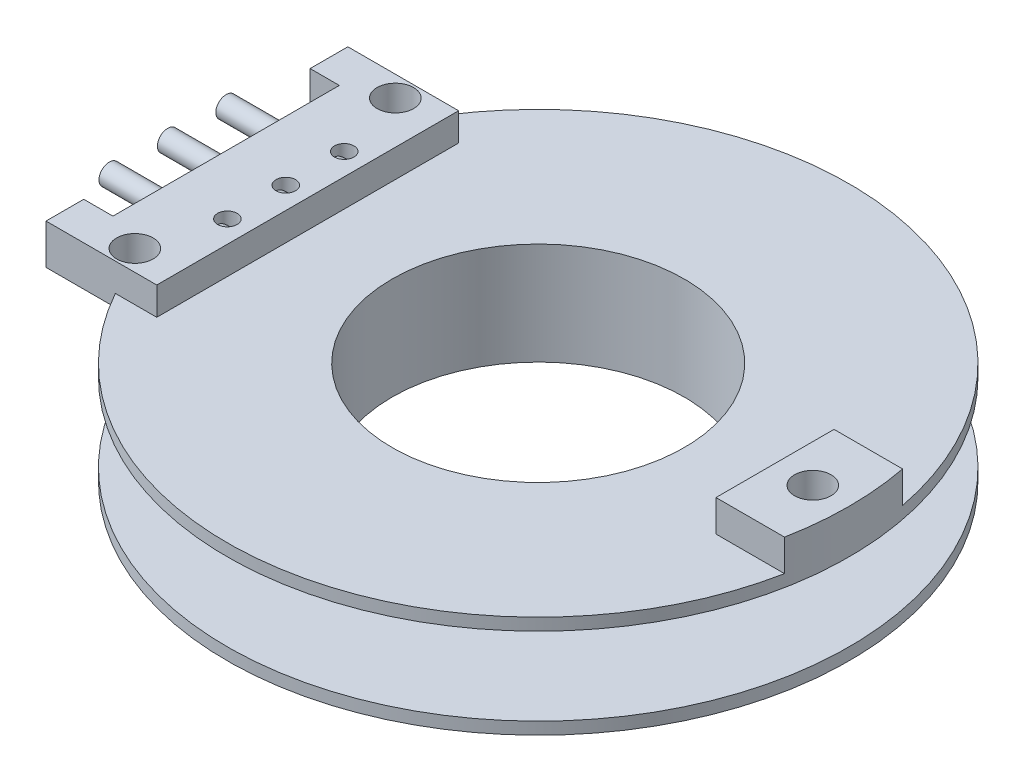
ISO-10303-21;
HEADER;
FILE_DESCRIPTION(('STEP AP214'),'2;1');
FILE_NAME('part.step','',(''),(''),'','','');
FILE_SCHEMA(('AUTOMOTIVE_DESIGN { 1 0 10303 214 1 1 1 1 }'));
ENDSEC;
DATA;
#1=APPLICATION_CONTEXT('core data for automotive mechanical design processes');
#2=APPLICATION_PROTOCOL_DEFINITION('international standard','automotive_design',2000,#1);
#3=PRODUCT_CONTEXT('',#1,'mechanical');
#4=PRODUCT('Part','Part','',(#3));
#5=PRODUCT_RELATED_PRODUCT_CATEGORY('part','',(#4));
#6=PRODUCT_DEFINITION_FORMATION('','',#4);
#7=PRODUCT_DEFINITION_CONTEXT('part definition',#1,'design');
#8=PRODUCT_DEFINITION('design','',#6,#7);
#9=PRODUCT_DEFINITION_SHAPE('','',#8);
#10=(LENGTH_UNIT() NAMED_UNIT(*) SI_UNIT(.MILLI.,.METRE.));
#11=(NAMED_UNIT(*) PLANE_ANGLE_UNIT() SI_UNIT($,.RADIAN.));
#12=(NAMED_UNIT(*) SI_UNIT($,.STERADIAN.) SOLID_ANGLE_UNIT());
#13=UNCERTAINTY_MEASURE_WITH_UNIT(LENGTH_MEASURE(1.E-05),#10,'distance_accuracy_value','');
#14=(GEOMETRIC_REPRESENTATION_CONTEXT(3) GLOBAL_UNCERTAINTY_ASSIGNED_CONTEXT((#13)) GLOBAL_UNIT_ASSIGNED_CONTEXT((#10,
#11,#12)) REPRESENTATION_CONTEXT('',''));
#15=CARTESIAN_POINT('',(0.,0.,0.));
#16=DIRECTION('',(0.,0.,1.));
#17=DIRECTION('',(1.,0.,0.));
#18=AXIS2_PLACEMENT_3D('',#15,#16,#17);
#19=CARTESIAN_POINT('',(-9.82,2.425,-2.4));
#20=DIRECTION('',(-1.,0.,0.));
#21=DIRECTION('',(0.,-1.,0.));
#22=AXIS2_PLACEMENT_3D('',#19,#20,#21);
#23=CYLINDRICAL_SURFACE('',#22,0.425);
#24=CARTESIAN_POINT('',(-9.82,2.425,-2.4));
#25=DIRECTION('',(-1.,0.,0.));
#26=DIRECTION('',(0.,-1.,0.));
#27=AXIS2_PLACEMENT_3D('',#24,#25,#26);
#28=CIRCLE('',#27,0.425);
#29=CARTESIAN_POINT('',(-9.82,2.,-2.4));
#30=VERTEX_POINT('',#29);
#31=EDGE_CURVE('E11',#30,#30,#28,.T.);
#32=ORIENTED_EDGE('',*,*,#31,.T.);
#33=EDGE_LOOP('',(#32));
#34=FACE_BOUND('',#33,.T.);
#35=CARTESIAN_POINT('',(-15.22,2.425,-2.4));
#36=DIRECTION('',(-1.,0.,0.));
#37=DIRECTION('',(0.,-1.,0.));
#38=AXIS2_PLACEMENT_3D('',#35,#36,#37);
#39=CIRCLE('',#38,0.425);
#40=CARTESIAN_POINT('',(-15.22,2.,-2.4));
#41=VERTEX_POINT('',#40);
#42=EDGE_CURVE('E58',#41,#41,#39,.T.);
#43=ORIENTED_EDGE('',*,*,#42,.F.);
#44=EDGE_LOOP('',(#43));
#45=FACE_BOUND('',#44,.T.);
#46=ADVANCED_FACE('F51',(#34,#45),#23,.T.);
#47=CARTESIAN_POINT('',(-9.82,2.425,-2.4));
#48=DIRECTION('',(-1.,0.,0.));
#49=DIRECTION('',(0.,-1.,0.));
#50=AXIS2_PLACEMENT_3D('',#47,#48,#49);
#51=PLANE('',#50);
#52=ORIENTED_EDGE('',*,*,#31,.F.);
#53=EDGE_LOOP('',(#52));
#54=FACE_BOUND('',#53,.T.);
#55=ADVANCED_FACE('F67',(#54),#51,.F.);
#56=CARTESIAN_POINT('',(-15.22,2.425,-2.4));
#57=DIRECTION('',(-1.,0.,0.));
#58=DIRECTION('',(0.,-1.,0.));
#59=AXIS2_PLACEMENT_3D('',#56,#57,#58);
#60=PLANE('',#59);
#61=ORIENTED_EDGE('',*,*,#42,.T.);
#62=EDGE_LOOP('',(#61));
#63=FACE_BOUND('',#62,.T.);
#64=ADVANCED_FACE('F64',(#63),#60,.T.);
#65=CLOSED_SHELL('',(#46,#55,#64));
#66=MANIFOLD_SOLID_BREP('B2',#65);
#67=CARTESIAN_POINT('',(-9.82,2.425,2.4));
#68=DIRECTION('',(-1.,0.,0.));
#69=DIRECTION('',(0.,-1.,0.));
#70=AXIS2_PLACEMENT_3D('',#67,#68,#69);
#71=CYLINDRICAL_SURFACE('',#70,0.425);
#72=CARTESIAN_POINT('',(-9.82,2.425,2.4));
#73=DIRECTION('',(-1.,0.,0.));
#74=DIRECTION('',(0.,-1.,0.));
#75=AXIS2_PLACEMENT_3D('',#72,#73,#74);
#76=CIRCLE('',#75,0.425);
#77=CARTESIAN_POINT('',(-9.82,2.,2.4));
#78=VERTEX_POINT('',#77);
#79=EDGE_CURVE('E50',#78,#78,#76,.T.);
#80=ORIENTED_EDGE('',*,*,#79,.T.);
#81=EDGE_LOOP('',(#80));
#82=FACE_BOUND('',#81,.T.);
#83=CARTESIAN_POINT('',(-15.22,2.425,2.4));
#84=DIRECTION('',(-1.,0.,0.));
#85=DIRECTION('',(0.,-1.,0.));
#86=AXIS2_PLACEMENT_3D('',#83,#84,#85);
#87=CIRCLE('',#86,0.425);
#88=CARTESIAN_POINT('',(-15.22,2.,2.4));
#89=VERTEX_POINT('',#88);
#90=EDGE_CURVE('E107',#89,#89,#87,.T.);
#91=ORIENTED_EDGE('',*,*,#90,.F.);
#92=EDGE_LOOP('',(#91));
#93=FACE_BOUND('',#92,.T.);
#94=ADVANCED_FACE('F100',(#82,#93),#71,.T.);
#95=CARTESIAN_POINT('',(-9.82,2.425,2.4));
#96=DIRECTION('',(-1.,0.,0.));
#97=DIRECTION('',(0.,-1.,0.));
#98=AXIS2_PLACEMENT_3D('',#95,#96,#97);
#99=PLANE('',#98);
#100=ORIENTED_EDGE('',*,*,#79,.F.);
#101=EDGE_LOOP('',(#100));
#102=FACE_BOUND('',#101,.T.);
#103=ADVANCED_FACE('F116',(#102),#99,.F.);
#104=CARTESIAN_POINT('',(-15.22,2.425,2.4));
#105=DIRECTION('',(-1.,0.,0.));
#106=DIRECTION('',(0.,-1.,0.));
#107=AXIS2_PLACEMENT_3D('',#104,#105,#106);
#108=PLANE('',#107);
#109=ORIENTED_EDGE('',*,*,#90,.T.);
#110=EDGE_LOOP('',(#109));
#111=FACE_BOUND('',#110,.T.);
#112=ADVANCED_FACE('F113',(#111),#108,.T.);
#113=CLOSED_SHELL('',(#94,#103,#112));
#114=MANIFOLD_SOLID_BREP('B6',#113);
#115=CARTESIAN_POINT('',(-9.82,2.425,0.));
#116=DIRECTION('',(-1.,0.,0.));
#117=DIRECTION('',(0.,-1.,0.));
#118=AXIS2_PLACEMENT_3D('',#115,#116,#117);
#119=CYLINDRICAL_SURFACE('',#118,0.425);
#120=CARTESIAN_POINT('',(-9.82,2.425,0.));
#121=DIRECTION('',(-1.,0.,0.));
#122=DIRECTION('',(0.,-1.,0.));
#123=AXIS2_PLACEMENT_3D('',#120,#121,#122);
#124=CIRCLE('',#123,0.425);
#125=CARTESIAN_POINT('',(-9.82,2.,0.));
#126=VERTEX_POINT('',#125);
#127=EDGE_CURVE('E99',#126,#126,#124,.T.);
#128=ORIENTED_EDGE('',*,*,#127,.T.);
#129=EDGE_LOOP('',(#128));
#130=FACE_BOUND('',#129,.T.);
#131=CARTESIAN_POINT('',(-15.22,2.425,0.));
#132=DIRECTION('',(-1.,0.,0.));
#133=DIRECTION('',(0.,-1.,0.));
#134=AXIS2_PLACEMENT_3D('',#131,#132,#133);
#135=CIRCLE('',#134,0.425);
#136=CARTESIAN_POINT('',(-15.22,2.,0.));
#137=VERTEX_POINT('',#136);
#138=EDGE_CURVE('E157',#137,#137,#135,.T.);
#139=ORIENTED_EDGE('',*,*,#138,.F.);
#140=EDGE_LOOP('',(#139));
#141=FACE_BOUND('',#140,.T.);
#142=ADVANCED_FACE('F150',(#130,#141),#119,.T.);
#143=CARTESIAN_POINT('',(-9.82,2.425,0.));
#144=DIRECTION('',(-1.,0.,0.));
#145=DIRECTION('',(0.,-1.,0.));
#146=AXIS2_PLACEMENT_3D('',#143,#144,#145);
#147=PLANE('',#146);
#148=ORIENTED_EDGE('',*,*,#127,.F.);
#149=EDGE_LOOP('',(#148));
#150=FACE_BOUND('',#149,.T.);
#151=ADVANCED_FACE('F166',(#150),#147,.F.);
#152=CARTESIAN_POINT('',(-15.22,2.425,0.));
#153=DIRECTION('',(-1.,0.,0.));
#154=DIRECTION('',(0.,-1.,0.));
#155=AXIS2_PLACEMENT_3D('',#152,#153,#154);
#156=PLANE('',#155);
#157=ORIENTED_EDGE('',*,*,#138,.T.);
#158=EDGE_LOOP('',(#157));
#159=FACE_BOUND('',#158,.T.);
#160=ADVANCED_FACE('F163',(#159),#156,.T.);
#161=CLOSED_SHELL('',(#142,#151,#160));
#162=MANIFOLD_SOLID_BREP('B45',#161);
#163=CARTESIAN_POINT('',(6.,2.1,0.));
#164=DIRECTION('',(0.,-1.,0.));
#165=DIRECTION('',(1.,0.,0.));
#166=AXIS2_PLACEMENT_3D('',#163,#164,#165);
#167=PLANE('',#166);
#168=CARTESIAN_POINT('',(0.,2.1,0.));
#169=DIRECTION('',(0.,1.,0.));
#170=DIRECTION('',(-1.,0.,0.));
#171=AXIS2_PLACEMENT_3D('',#168,#169,#170);
#172=CIRCLE('',#171,6.);
#173=CARTESIAN_POINT('',(-6.,2.1,0.));
#174=VERTEX_POINT('',#173);
#175=EDGE_CURVE('E446',#174,#174,#172,.T.);
#176=ORIENTED_EDGE('',*,*,#175,.F.);
#177=EDGE_LOOP('',(#176));
#178=FACE_BOUND('',#177,.T.);
#179=CARTESIAN_POINT('',(0.,2.1,0.));
#180=DIRECTION('',(0.,1.,0.));
#181=DIRECTION('',(-1.,0.,0.));
#182=AXIS2_PLACEMENT_3D('',#179,#180,#181);
#183=CIRCLE('',#182,12.775);
#184=CARTESIAN_POINT('',(12.5427269762201,2.1,-2.425));
#185=VERTEX_POINT('',#184);
#186=CARTESIAN_POINT('',(-11.1696295820408,2.1,-6.2));
#187=VERTEX_POINT('',#186);
#188=EDGE_CURVE('E451',#185,#187,#183,.T.);
#189=ORIENTED_EDGE('',*,*,#188,.T.);
#190=DIRECTION('',(1.,0.,0.));
#191=VECTOR('',#190,1.);
#192=CARTESIAN_POINT('',(6.,2.1,-6.2));
#193=LINE('',#192,#191);
#194=CARTESIAN_POINT('',(-9.47,2.1,-6.2));
#195=VERTEX_POINT('',#194);
#196=EDGE_CURVE('E206',#187,#195,#193,.T.);
#197=ORIENTED_EDGE('',*,*,#196,.T.);
#198=DIRECTION('',(0.,0.,1.));
#199=VECTOR('',#198,1.);
#200=CARTESIAN_POINT('',(-9.47,2.1,0.));
#201=LINE('',#200,#199);
#202=CARTESIAN_POINT('',(-9.47,2.1,6.2));
#203=VERTEX_POINT('',#202);
#204=EDGE_CURVE('E213',#195,#203,#201,.T.);
#205=ORIENTED_EDGE('',*,*,#204,.T.);
#206=DIRECTION('',(-1.,0.,0.));
#207=VECTOR('',#206,1.);
#208=CARTESIAN_POINT('',(6.,2.1,6.2));
#209=LINE('',#208,#207);
#210=CARTESIAN_POINT('',(-11.1696295820408,2.1,6.2));
#211=VERTEX_POINT('',#210);
#212=EDGE_CURVE('E379',#203,#211,#209,.T.);
#213=ORIENTED_EDGE('',*,*,#212,.T.);
#214=CARTESIAN_POINT('',(12.5427269762201,2.1,2.425));
#215=VERTEX_POINT('',#214);
#216=EDGE_CURVE('E450',#211,#215,#183,.T.);
#217=ORIENTED_EDGE('',*,*,#216,.T.);
#218=DIRECTION('',(1.,0.,0.));
#219=VECTOR('',#218,1.);
#220=CARTESIAN_POINT('',(9.72728122344574,2.1,2.425));
#221=LINE('',#220,#219);
#222=CARTESIAN_POINT('',(9.72728122344574,2.1,2.425));
#223=VERTEX_POINT('',#222);
#224=EDGE_CURVE('E405',#223,#215,#221,.T.);
#225=ORIENTED_EDGE('',*,*,#224,.F.);
#226=DIRECTION('',(0.,0.,1.));
#227=VECTOR('',#226,1.);
#228=CARTESIAN_POINT('',(9.72728122344574,2.1,-2.425));
#229=LINE('',#228,#227);
#230=CARTESIAN_POINT('',(9.72728122344574,2.1,-2.425));
#231=VERTEX_POINT('',#230);
#232=EDGE_CURVE('E414',#231,#223,#229,.T.);
#233=ORIENTED_EDGE('',*,*,#232,.F.);
#234=DIRECTION('',(-1.,0.,0.));
#235=VECTOR('',#234,1.);
#236=CARTESIAN_POINT('',(9.72728122344574,2.1,-2.425));
#237=LINE('',#236,#235);
#238=EDGE_CURVE('E400',#185,#231,#237,.T.);
#239=ORIENTED_EDGE('',*,*,#238,.F.);
#240=EDGE_LOOP('',(#189,#197,#205,#213,#217,#225,#233,#239));
#241=FACE_BOUND('',#240,.T.);
#242=ADVANCED_FACE('F191',(#178,#241),#167,.F.);
#243=CARTESIAN_POINT('',(12.775,1.6,0.));
#244=DIRECTION('',(0.,1.,0.));
#245=DIRECTION('',(-1.,0.,0.));
#246=AXIS2_PLACEMENT_3D('',#243,#244,#245);
#247=PLANE('',#246);
#248=CARTESIAN_POINT('',(11.28,1.6,0.));
#249=DIRECTION('',(0.,1.,0.));
#250=DIRECTION('',(-1.,0.,0.));
#251=AXIS2_PLACEMENT_3D('',#248,#249,#250);
#252=CIRCLE('',#251,0.75);
#253=CARTESIAN_POINT('',(10.53,1.6,0.));
#254=VERTEX_POINT('',#253);
#255=EDGE_CURVE('E518',#254,#254,#252,.F.);
#256=ORIENTED_EDGE('',*,*,#255,.F.);
#257=EDGE_LOOP('',(#256));
#258=FACE_BOUND('',#257,.T.);
#259=CARTESIAN_POINT('',(-11.22,1.59999999999999,5.35));
#260=DIRECTION('',(0.,1.,0.));
#261=DIRECTION('',(-1.,0.,0.));
#262=AXIS2_PLACEMENT_3D('',#259,#260,#261);
#263=CIRCLE('',#262,0.75);
#264=CARTESIAN_POINT('',(-11.97,1.59999999999999,5.35));
#265=VERTEX_POINT('',#264);
#266=EDGE_CURVE('E502',#265,#265,#263,.F.);
#267=ORIENTED_EDGE('',*,*,#266,.F.);
#268=EDGE_LOOP('',(#267));
#269=FACE_BOUND('',#268,.T.);
#270=CARTESIAN_POINT('',(-11.22,1.59999999999999,-5.35));
#271=DIRECTION('',(0.,1.,0.));
#272=DIRECTION('',(-1.,0.,0.));
#273=AXIS2_PLACEMENT_3D('',#270,#271,#272);
#274=CIRCLE('',#273,0.75);
#275=CARTESIAN_POINT('',(-11.97,1.59999999999999,-5.35));
#276=VERTEX_POINT('',#275);
#277=EDGE_CURVE('E331',#276,#276,#274,.F.);
#278=ORIENTED_EDGE('',*,*,#277,.F.);
#279=EDGE_LOOP('',(#278));
#280=FACE_BOUND('',#279,.T.);
#281=DIRECTION('',(-1.,0.,0.));
#282=VECTOR('',#281,1.);
#283=CARTESIAN_POINT('',(-14.02,1.6,-6.2));
#284=LINE('',#283,#282);
#285=CARTESIAN_POINT('',(-11.1696295820408,1.6,-6.2));
#286=VERTEX_POINT('',#285);
#287=CARTESIAN_POINT('',(-14.02,1.6,-6.2));
#288=VERTEX_POINT('',#287);
#289=EDGE_CURVE('E314',#286,#288,#284,.T.);
#290=ORIENTED_EDGE('',*,*,#289,.F.);
#291=CARTESIAN_POINT('',(0.,1.6,0.));
#292=DIRECTION('',(0.,1.,0.));
#293=DIRECTION('',(-1.,0.,0.));
#294=AXIS2_PLACEMENT_3D('',#291,#292,#293);
#295=CIRCLE('',#294,12.775);
#296=CARTESIAN_POINT('',(-11.1696295820408,1.6,6.2));
#297=VERTEX_POINT('',#296);
#298=EDGE_CURVE('E454',#297,#286,#295,.T.);
#299=ORIENTED_EDGE('',*,*,#298,.F.);
#300=DIRECTION('',(1.,0.,0.));
#301=VECTOR('',#300,1.);
#302=CARTESIAN_POINT('',(-9.47,1.6,6.2));
#303=LINE('',#302,#301);
#304=CARTESIAN_POINT('',(-14.02,1.6,6.2));
#305=VERTEX_POINT('',#304);
#306=EDGE_CURVE('E372',#305,#297,#303,.T.);
#307=ORIENTED_EDGE('',*,*,#306,.F.);
#308=DIRECTION('',(0.,0.,1.));
#309=VECTOR('',#308,1.);
#310=CARTESIAN_POINT('',(-14.02,1.6,6.2));
#311=LINE('',#310,#309);
#312=CARTESIAN_POINT('',(-14.02,1.6,4.65));
#313=VERTEX_POINT('',#312);
#314=EDGE_CURVE('E368',#313,#305,#311,.T.);
#315=ORIENTED_EDGE('',*,*,#314,.F.);
#316=DIRECTION('',(-1.,0.,0.));
#317=VECTOR('',#316,1.);
#318=CARTESIAN_POINT('',(-14.02,1.6,4.65));
#319=LINE('',#318,#317);
#320=CARTESIAN_POINT('',(-12.82,1.6,4.65));
#321=VERTEX_POINT('',#320);
#322=EDGE_CURVE('E364',#321,#313,#319,.T.);
#323=ORIENTED_EDGE('',*,*,#322,.F.);
#324=DIRECTION('',(0.,0.,1.));
#325=VECTOR('',#324,1.);
#326=CARTESIAN_POINT('',(-12.82,1.6,4.65));
#327=LINE('',#326,#325);
#328=CARTESIAN_POINT('',(-12.82,1.6,-4.65));
#329=VERTEX_POINT('',#328);
#330=EDGE_CURVE('E360',#329,#321,#327,.T.);
#331=ORIENTED_EDGE('',*,*,#330,.F.);
#332=DIRECTION('',(1.,0.,0.));
#333=VECTOR('',#332,1.);
#334=CARTESIAN_POINT('',(-12.82,1.6,-4.65));
#335=LINE('',#334,#333);
#336=CARTESIAN_POINT('',(-14.02,1.6,-4.65));
#337=VERTEX_POINT('',#336);
#338=EDGE_CURVE('E358',#337,#329,#335,.T.);
#339=ORIENTED_EDGE('',*,*,#338,.F.);
#340=DIRECTION('',(0.,0.,1.));
#341=VECTOR('',#340,1.);
#342=CARTESIAN_POINT('',(-14.02,1.6,-4.65));
#343=LINE('',#342,#341);
#344=EDGE_CURVE('E308',#288,#337,#343,.T.);
#345=ORIENTED_EDGE('',*,*,#344,.F.);
#346=EDGE_LOOP('',(#290,#299,#307,#315,#323,#331,#339,#345));
#347=FACE_BOUND('',#346,.T.);
#348=CARTESIAN_POINT('',(0.,1.6,0.));
#349=DIRECTION('',(0.,1.,0.));
#350=DIRECTION('',(-1.,0.,0.));
#351=AXIS2_PLACEMENT_3D('',#348,#349,#350);
#352=CIRCLE('',#351,7.);
#353=CARTESIAN_POINT('',(-7.,1.59999999999999,0.));
#354=VERTEX_POINT('',#353);
#355=EDGE_CURVE('E430',#354,#354,#352,.T.);
#356=ORIENTED_EDGE('',*,*,#355,.T.);
#357=EDGE_LOOP('',(#356));
#358=FACE_BOUND('',#357,.T.);
#359=ADVANCED_FACE('F193',(#258,#269,#280,#347,#358),#247,.F.);
#360=CARTESIAN_POINT('',(0.,2.1,0.));
#361=DIRECTION('',(0.,1.,0.));
#362=DIRECTION('',(-1.,0.,0.));
#363=AXIS2_PLACEMENT_3D('',#360,#361,#362);
#364=CYLINDRICAL_SURFACE('',#363,12.775);
#365=ORIENTED_EDGE('',*,*,#298,.T.);
#366=DIRECTION('',(0.,1.,0.));
#367=VECTOR('',#366,1.);
#368=CARTESIAN_POINT('',(-11.1696295820408,2.1,-6.2));
#369=LINE('',#368,#367);
#370=EDGE_CURVE('E148',#286,#187,#369,.T.);
#371=ORIENTED_EDGE('',*,*,#370,.T.);
#372=ORIENTED_EDGE('',*,*,#188,.F.);
#373=DIRECTION('',(0.,-1.,0.));
#374=VECTOR('',#373,1.);
#375=CARTESIAN_POINT('',(12.5427269762201,3.4,-2.425));
#376=LINE('',#375,#374);
#377=CARTESIAN_POINT('',(12.5427269762201,3.4,-2.425));
#378=VERTEX_POINT('',#377);
#379=EDGE_CURVE('E427',#378,#185,#376,.T.);
#380=ORIENTED_EDGE('',*,*,#379,.F.);
#381=CARTESIAN_POINT('',(0.,3.4,0.));
#382=DIRECTION('',(0.,1.,0.));
#383=DIRECTION('',(-1.,0.,0.));
#384=AXIS2_PLACEMENT_3D('',#381,#382,#383);
#385=CIRCLE('',#384,12.775);
#386=CARTESIAN_POINT('',(12.5427269762201,3.4,2.425));
#387=VERTEX_POINT('',#386);
#388=EDGE_CURVE('E401',#387,#378,#385,.T.);
#389=ORIENTED_EDGE('',*,*,#388,.F.);
#390=DIRECTION('',(0.,-1.,0.));
#391=VECTOR('',#390,1.);
#392=CARTESIAN_POINT('',(12.5427269762201,3.4,2.425));
#393=LINE('',#392,#391);
#394=EDGE_CURVE('E411',#387,#215,#393,.T.);
#395=ORIENTED_EDGE('',*,*,#394,.T.);
#396=ORIENTED_EDGE('',*,*,#216,.F.);
#397=DIRECTION('',(0.,1.,0.));
#398=VECTOR('',#397,1.);
#399=CARTESIAN_POINT('',(-11.1696295820408,2.1,6.2));
#400=LINE('',#399,#398);
#401=EDGE_CURVE('E199',#211,#297,#400,.F.);
#402=ORIENTED_EDGE('',*,*,#401,.T.);
#403=EDGE_LOOP('',(#365,#371,#372,#380,#389,#395,#396,#402));
#404=FACE_BOUND('',#403,.T.);
#405=ADVANCED_FACE('F461',(#404),#364,.T.);
#406=CARTESIAN_POINT('',(0.,2.1,0.));
#407=DIRECTION('',(0.,1.,0.));
#408=DIRECTION('',(-1.,0.,0.));
#409=AXIS2_PLACEMENT_3D('',#406,#407,#408);
#410=CYLINDRICAL_SURFACE('',#409,6.);
#411=CARTESIAN_POINT('',(0.,-2.1,0.));
#412=DIRECTION('',(0.,1.,0.));
#413=DIRECTION('',(-1.,0.,0.));
#414=AXIS2_PLACEMENT_3D('',#411,#412,#413);
#415=CIRCLE('',#414,6.);
#416=CARTESIAN_POINT('',(-6.,-2.1,0.));
#417=VERTEX_POINT('',#416);
#418=EDGE_CURVE('E443',#417,#417,#415,.T.);
#419=ORIENTED_EDGE('',*,*,#418,.F.);
#420=EDGE_LOOP('',(#419));
#421=FACE_BOUND('',#420,.T.);
#422=ORIENTED_EDGE('',*,*,#175,.T.);
#423=EDGE_LOOP('',(#422));
#424=FACE_BOUND('',#423,.T.);
#425=ADVANCED_FACE('F562',(#421,#424),#410,.F.);
#426=CARTESIAN_POINT('',(12.775,-2.1,0.));
#427=DIRECTION('',(0.,1.,0.));
#428=DIRECTION('',(-1.,0.,0.));
#429=AXIS2_PLACEMENT_3D('',#426,#427,#428);
#430=PLANE('',#429);
#431=CARTESIAN_POINT('',(0.,-2.1,0.));
#432=DIRECTION('',(0.,1.,0.));
#433=DIRECTION('',(-1.,0.,0.));
#434=AXIS2_PLACEMENT_3D('',#431,#432,#433);
#435=CIRCLE('',#434,12.775);
#436=CARTESIAN_POINT('',(-12.775,-2.1,0.));
#437=VERTEX_POINT('',#436);
#438=EDGE_CURVE('E440',#437,#437,#435,.T.);
#439=ORIENTED_EDGE('',*,*,#438,.F.);
#440=EDGE_LOOP('',(#439));
#441=FACE_BOUND('',#440,.T.);
#442=ORIENTED_EDGE('',*,*,#418,.T.);
#443=EDGE_LOOP('',(#442));
#444=FACE_BOUND('',#443,.T.);
#445=ADVANCED_FACE('F568',(#441,#444),#430,.F.);
#446=CARTESIAN_POINT('',(0.,2.1,0.));
#447=DIRECTION('',(0.,1.,0.));
#448=DIRECTION('',(-1.,0.,0.));
#449=AXIS2_PLACEMENT_3D('',#446,#447,#448);
#450=CYLINDRICAL_SURFACE('',#449,12.775);
#451=CARTESIAN_POINT('',(0.,-1.6,0.));
#452=DIRECTION('',(0.,1.,0.));
#453=DIRECTION('',(-1.,0.,0.));
#454=AXIS2_PLACEMENT_3D('',#451,#452,#453);
#455=CIRCLE('',#454,12.775);
#456=CARTESIAN_POINT('',(-12.775,-1.6,0.));
#457=VERTEX_POINT('',#456);
#458=EDGE_CURVE('E437',#457,#457,#455,.T.);
#459=ORIENTED_EDGE('',*,*,#458,.F.);
#460=EDGE_LOOP('',(#459));
#461=FACE_BOUND('',#460,.T.);
#462=ORIENTED_EDGE('',*,*,#438,.T.);
#463=EDGE_LOOP('',(#462));
#464=FACE_BOUND('',#463,.T.);
#465=ADVANCED_FACE('F573',(#461,#464),#450,.T.);
#466=CARTESIAN_POINT('',(7.,-1.6,0.));
#467=DIRECTION('',(0.,-1.,0.));
#468=DIRECTION('',(1.,0.,0.));
#469=AXIS2_PLACEMENT_3D('',#466,#467,#468);
#470=PLANE('',#469);
#471=CARTESIAN_POINT('',(0.,-1.6,0.));
#472=DIRECTION('',(0.,1.,0.));
#473=DIRECTION('',(-1.,0.,0.));
#474=AXIS2_PLACEMENT_3D('',#471,#472,#473);
#475=CIRCLE('',#474,7.);
#476=CARTESIAN_POINT('',(-7.,-1.6,0.));
#477=VERTEX_POINT('',#476);
#478=EDGE_CURVE('E434',#477,#477,#475,.T.);
#479=ORIENTED_EDGE('',*,*,#478,.F.);
#480=EDGE_LOOP('',(#479));
#481=FACE_BOUND('',#480,.T.);
#482=ORIENTED_EDGE('',*,*,#458,.T.);
#483=EDGE_LOOP('',(#482));
#484=FACE_BOUND('',#483,.T.);
#485=ADVANCED_FACE('F581',(#481,#484),#470,.F.);
#486=CARTESIAN_POINT('',(0.,2.1,0.));
#487=DIRECTION('',(0.,1.,0.));
#488=DIRECTION('',(-1.,0.,0.));
#489=AXIS2_PLACEMENT_3D('',#486,#487,#488);
#490=CYLINDRICAL_SURFACE('',#489,7.);
#491=ORIENTED_EDGE('',*,*,#355,.F.);
#492=EDGE_LOOP('',(#491));
#493=FACE_BOUND('',#492,.T.);
#494=ORIENTED_EDGE('',*,*,#478,.T.);
#495=EDGE_LOOP('',(#494));
#496=FACE_BOUND('',#495,.T.);
#497=ADVANCED_FACE('F588',(#493,#496),#490,.T.);
#498=CARTESIAN_POINT('',(9.72728122344574,3.4,-2.425));
#499=DIRECTION('',(0.,0.,1.));
#500=DIRECTION('',(1.,0.,0.));
#501=AXIS2_PLACEMENT_3D('',#498,#499,#500);
#502=PLANE('',#501);
#503=ORIENTED_EDGE('',*,*,#238,.T.);
#504=DIRECTION('',(0.,-1.,0.));
#505=VECTOR('',#504,1.);
#506=CARTESIAN_POINT('',(9.72728122344574,3.4,-2.425));
#507=LINE('',#506,#505);
#508=CARTESIAN_POINT('',(9.72728122344574,3.4,-2.425));
#509=VERTEX_POINT('',#508);
#510=EDGE_CURVE('E424',#509,#231,#507,.T.);
#511=ORIENTED_EDGE('',*,*,#510,.F.);
#512=DIRECTION('',(-1.,0.,0.));
#513=VECTOR('',#512,1.);
#514=CARTESIAN_POINT('',(9.72728122344574,3.4,-2.425));
#515=LINE('',#514,#513);
#516=EDGE_CURVE('E404',#378,#509,#515,.T.);
#517=ORIENTED_EDGE('',*,*,#516,.F.);
#518=ORIENTED_EDGE('',*,*,#379,.T.);
#519=EDGE_LOOP('',(#503,#511,#517,#518));
#520=FACE_BOUND('',#519,.T.);
#521=ADVANCED_FACE('F488',(#520),#502,.F.);
#522=CARTESIAN_POINT('',(9.72728122344574,3.4,-2.425));
#523=DIRECTION('',(1.,0.,0.));
#524=DIRECTION('',(0.,1.,0.));
#525=AXIS2_PLACEMENT_3D('',#522,#523,#524);
#526=PLANE('',#525);
#527=ORIENTED_EDGE('',*,*,#232,.T.);
#528=DIRECTION('',(0.,-1.,0.));
#529=VECTOR('',#528,1.);
#530=CARTESIAN_POINT('',(9.72728122344574,3.4,2.425));
#531=LINE('',#530,#529);
#532=CARTESIAN_POINT('',(9.72728122344574,3.4,2.425));
#533=VERTEX_POINT('',#532);
#534=EDGE_CURVE('E421',#533,#223,#531,.T.);
#535=ORIENTED_EDGE('',*,*,#534,.F.);
#536=DIRECTION('',(0.,0.,1.));
#537=VECTOR('',#536,1.);
#538=CARTESIAN_POINT('',(9.72728122344574,3.4,-2.425));
#539=LINE('',#538,#537);
#540=EDGE_CURVE('E407',#509,#533,#539,.T.);
#541=ORIENTED_EDGE('',*,*,#540,.F.);
#542=ORIENTED_EDGE('',*,*,#510,.T.);
#543=EDGE_LOOP('',(#527,#535,#541,#542));
#544=FACE_BOUND('',#543,.T.);
#545=ADVANCED_FACE('F491',(#544),#526,.F.);
#546=CARTESIAN_POINT('',(9.72728122344574,3.4,2.425));
#547=DIRECTION('',(0.,0.,-1.));
#548=DIRECTION('',(-1.,0.,0.));
#549=AXIS2_PLACEMENT_3D('',#546,#547,#548);
#550=PLANE('',#549);
#551=ORIENTED_EDGE('',*,*,#224,.T.);
#552=ORIENTED_EDGE('',*,*,#394,.F.);
#553=DIRECTION('',(1.,0.,0.));
#554=VECTOR('',#553,1.);
#555=CARTESIAN_POINT('',(9.72728122344574,3.4,2.425));
#556=LINE('',#555,#554);
#557=EDGE_CURVE('E409',#533,#387,#556,.T.);
#558=ORIENTED_EDGE('',*,*,#557,.F.);
#559=ORIENTED_EDGE('',*,*,#534,.T.);
#560=EDGE_LOOP('',(#551,#552,#558,#559));
#561=FACE_BOUND('',#560,.T.);
#562=ADVANCED_FACE('F499',(#561),#550,.F.);
#563=CARTESIAN_POINT('',(0.,3.4,0.));
#564=DIRECTION('',(0.,1.,0.));
#565=DIRECTION('',(-1.,0.,0.));
#566=AXIS2_PLACEMENT_3D('',#563,#564,#565);
#567=PLANE('',#566);
#568=CARTESIAN_POINT('',(11.28,3.4,0.));
#569=DIRECTION('',(0.,1.,0.));
#570=DIRECTION('',(-1.,0.,0.));
#571=AXIS2_PLACEMENT_3D('',#568,#569,#570);
#572=CIRCLE('',#571,0.75);
#573=CARTESIAN_POINT('',(10.53,3.4,0.));
#574=VERTEX_POINT('',#573);
#575=EDGE_CURVE('E523',#574,#574,#572,.T.);
#576=ORIENTED_EDGE('',*,*,#575,.F.);
#577=EDGE_LOOP('',(#576));
#578=FACE_BOUND('',#577,.T.);
#579=ORIENTED_EDGE('',*,*,#388,.T.);
#580=ORIENTED_EDGE('',*,*,#516,.T.);
#581=ORIENTED_EDGE('',*,*,#540,.T.);
#582=ORIENTED_EDGE('',*,*,#557,.T.);
#583=EDGE_LOOP('',(#579,#580,#581,#582));
#584=FACE_BOUND('',#583,.T.);
#585=ADVANCED_FACE('F495',(#578,#584),#567,.T.);
#586=CARTESIAN_POINT('',(-9.47,1.6,-6.2));
#587=DIRECTION('',(1.,0.,0.));
#588=DIRECTION('',(0.,1.,0.));
#589=AXIS2_PLACEMENT_3D('',#586,#587,#588);
#590=PLANE('',#589);
#591=ORIENTED_EDGE('',*,*,#204,.F.);
#592=DIRECTION('',(0.,1.,0.));
#593=VECTOR('',#592,1.);
#594=CARTESIAN_POINT('',(-9.47,1.6,-6.2));
#595=LINE('',#594,#593);
#596=CARTESIAN_POINT('',(-9.47,3.25,-6.2));
#597=VERTEX_POINT('',#596);
#598=EDGE_CURVE('E380',#195,#597,#595,.T.);
#599=ORIENTED_EDGE('',*,*,#598,.T.);
#600=DIRECTION('',(0.,0.,-1.));
#601=VECTOR('',#600,1.);
#602=CARTESIAN_POINT('',(-9.47,3.25,-6.2));
#603=LINE('',#602,#601);
#604=CARTESIAN_POINT('',(-9.47,3.25,6.2));
#605=VERTEX_POINT('',#604);
#606=EDGE_CURVE('E353',#605,#597,#603,.T.);
#607=ORIENTED_EDGE('',*,*,#606,.F.);
#608=DIRECTION('',(0.,1.,0.));
#609=VECTOR('',#608,1.);
#610=CARTESIAN_POINT('',(-9.47,1.6,6.2));
#611=LINE('',#610,#609);
#612=EDGE_CURVE('E382',#203,#605,#611,.T.);
#613=ORIENTED_EDGE('',*,*,#612,.F.);
#614=EDGE_LOOP('',(#591,#599,#607,#613));
#615=FACE_BOUND('',#614,.T.);
#616=ADVANCED_FACE('F601',(#615),#590,.T.);
#617=CARTESIAN_POINT('',(-14.02,1.6,-6.2));
#618=DIRECTION('',(0.,0.,-1.));
#619=DIRECTION('',(-1.,0.,0.));
#620=AXIS2_PLACEMENT_3D('',#617,#618,#619);
#621=PLANE('',#620);
#622=ORIENTED_EDGE('',*,*,#196,.F.);
#623=ORIENTED_EDGE('',*,*,#370,.F.);
#624=ORIENTED_EDGE('',*,*,#289,.T.);
#625=DIRECTION('',(0.,1.,0.));
#626=VECTOR('',#625,1.);
#627=CARTESIAN_POINT('',(-14.02,1.6,-6.2));
#628=LINE('',#627,#626);
#629=CARTESIAN_POINT('',(-14.02,3.25,-6.2));
#630=VERTEX_POINT('',#629);
#631=EDGE_CURVE('E377',#288,#630,#628,.T.);
#632=ORIENTED_EDGE('',*,*,#631,.T.);
#633=DIRECTION('',(-1.,0.,0.));
#634=VECTOR('',#633,1.);
#635=CARTESIAN_POINT('',(-14.02,3.25,-6.2));
#636=LINE('',#635,#634);
#637=EDGE_CURVE('E329',#597,#630,#636,.T.);
#638=ORIENTED_EDGE('',*,*,#637,.F.);
#639=ORIENTED_EDGE('',*,*,#598,.F.);
#640=EDGE_LOOP('',(#622,#623,#624,#632,#638,#639));
#641=FACE_BOUND('',#640,.T.);
#642=ADVANCED_FACE('F482',(#641),#621,.T.);
#643=CARTESIAN_POINT('',(-9.47,1.6,6.2));
#644=DIRECTION('',(0.,0.,1.));
#645=DIRECTION('',(1.,0.,0.));
#646=AXIS2_PLACEMENT_3D('',#643,#644,#645);
#647=PLANE('',#646);
#648=ORIENTED_EDGE('',*,*,#212,.F.);
#649=ORIENTED_EDGE('',*,*,#612,.T.);
#650=DIRECTION('',(1.,0.,0.));
#651=VECTOR('',#650,1.);
#652=CARTESIAN_POINT('',(-9.47,3.25,6.2));
#653=LINE('',#652,#651);
#654=CARTESIAN_POINT('',(-14.02,3.25,6.2));
#655=VERTEX_POINT('',#654);
#656=EDGE_CURVE('E349',#655,#605,#653,.T.);
#657=ORIENTED_EDGE('',*,*,#656,.F.);
#658=DIRECTION('',(0.,1.,0.));
#659=VECTOR('',#658,1.);
#660=CARTESIAN_POINT('',(-14.02,1.6,6.2));
#661=LINE('',#660,#659);
#662=EDGE_CURVE('E385',#305,#655,#661,.T.);
#663=ORIENTED_EDGE('',*,*,#662,.F.);
#664=ORIENTED_EDGE('',*,*,#306,.T.);
#665=ORIENTED_EDGE('',*,*,#401,.F.);
#666=EDGE_LOOP('',(#648,#649,#657,#663,#664,#665));
#667=FACE_BOUND('',#666,.T.);
#668=ADVANCED_FACE('F465',(#667),#647,.T.);
#669=CARTESIAN_POINT('',(-14.02,1.6,-4.65));
#670=DIRECTION('',(-1.,0.,0.));
#671=DIRECTION('',(0.,-1.,0.));
#672=AXIS2_PLACEMENT_3D('',#669,#670,#671);
#673=PLANE('',#672);
#674=DIRECTION('',(0.,1.,0.));
#675=VECTOR('',#674,1.);
#676=CARTESIAN_POINT('',(-14.02,1.6,-4.65));
#677=LINE('',#676,#675);
#678=CARTESIAN_POINT('',(-14.02,3.25,-4.65));
#679=VERTEX_POINT('',#678);
#680=EDGE_CURVE('E301',#337,#679,#677,.T.);
#681=ORIENTED_EDGE('',*,*,#680,.T.);
#682=DIRECTION('',(0.,0.,1.));
#683=VECTOR('',#682,1.);
#684=CARTESIAN_POINT('',(-14.02,3.25,-4.65));
#685=LINE('',#684,#683);
#686=EDGE_CURVE('E306',#630,#679,#685,.T.);
#687=ORIENTED_EDGE('',*,*,#686,.F.);
#688=ORIENTED_EDGE('',*,*,#631,.F.);
#689=ORIENTED_EDGE('',*,*,#344,.T.);
#690=EDGE_LOOP('',(#681,#687,#688,#689));
#691=FACE_BOUND('',#690,.T.);
#692=ADVANCED_FACE('F303',(#691),#673,.T.);
#693=CARTESIAN_POINT('',(-14.02,1.6,6.2));
#694=DIRECTION('',(-1.,0.,0.));
#695=DIRECTION('',(0.,-1.,0.));
#696=AXIS2_PLACEMENT_3D('',#693,#694,#695);
#697=PLANE('',#696);
#698=ORIENTED_EDGE('',*,*,#662,.T.);
#699=DIRECTION('',(0.,0.,1.));
#700=VECTOR('',#699,1.);
#701=CARTESIAN_POINT('',(-14.02,3.25,6.2));
#702=LINE('',#701,#700);
#703=CARTESIAN_POINT('',(-14.02,3.25,4.65));
#704=VERTEX_POINT('',#703);
#705=EDGE_CURVE('E345',#704,#655,#702,.T.);
#706=ORIENTED_EDGE('',*,*,#705,.F.);
#707=DIRECTION('',(0.,1.,0.));
#708=VECTOR('',#707,1.);
#709=CARTESIAN_POINT('',(-14.02,1.6,4.65));
#710=LINE('',#709,#708);
#711=EDGE_CURVE('E388',#313,#704,#710,.T.);
#712=ORIENTED_EDGE('',*,*,#711,.F.);
#713=ORIENTED_EDGE('',*,*,#314,.T.);
#714=EDGE_LOOP('',(#698,#706,#712,#713));
#715=FACE_BOUND('',#714,.T.);
#716=ADVANCED_FACE('F473',(#715),#697,.T.);
#717=CARTESIAN_POINT('',(-14.02,1.6,4.65));
#718=DIRECTION('',(0.,0.,-1.));
#719=DIRECTION('',(-1.,0.,0.));
#720=AXIS2_PLACEMENT_3D('',#717,#718,#719);
#721=PLANE('',#720);
#722=ORIENTED_EDGE('',*,*,#711,.T.);
#723=DIRECTION('',(-1.,0.,0.));
#724=VECTOR('',#723,1.);
#725=CARTESIAN_POINT('',(-14.02,3.25,4.65));
#726=LINE('',#725,#724);
#727=CARTESIAN_POINT('',(-12.82,3.25,4.65));
#728=VERTEX_POINT('',#727);
#729=EDGE_CURVE('E341',#728,#704,#726,.T.);
#730=ORIENTED_EDGE('',*,*,#729,.F.);
#731=DIRECTION('',(0.,1.,0.));
#732=VECTOR('',#731,1.);
#733=CARTESIAN_POINT('',(-12.82,1.6,4.65));
#734=LINE('',#733,#732);
#735=EDGE_CURVE('E391',#321,#728,#734,.T.);
#736=ORIENTED_EDGE('',*,*,#735,.F.);
#737=ORIENTED_EDGE('',*,*,#322,.T.);
#738=EDGE_LOOP('',(#722,#730,#736,#737));
#739=FACE_BOUND('',#738,.T.);
#740=ADVANCED_FACE('F477',(#739),#721,.T.);
#741=CARTESIAN_POINT('',(-12.82,1.6,4.65));
#742=DIRECTION('',(-1.,0.,0.));
#743=DIRECTION('',(0.,-1.,0.));
#744=AXIS2_PLACEMENT_3D('',#741,#742,#743);
#745=PLANE('',#744);
#746=ORIENTED_EDGE('',*,*,#735,.T.);
#747=DIRECTION('',(0.,0.,1.));
#748=VECTOR('',#747,1.);
#749=CARTESIAN_POINT('',(-12.82,3.25,4.65));
#750=LINE('',#749,#748);
#751=CARTESIAN_POINT('',(-12.82,3.25,-4.65));
#752=VERTEX_POINT('',#751);
#753=EDGE_CURVE('E323',#752,#728,#750,.T.);
#754=ORIENTED_EDGE('',*,*,#753,.F.);
#755=DIRECTION('',(0.,1.,0.));
#756=VECTOR('',#755,1.);
#757=CARTESIAN_POINT('',(-12.82,1.6,-4.65));
#758=LINE('',#757,#756);
#759=EDGE_CURVE('E313',#329,#752,#758,.T.);
#760=ORIENTED_EDGE('',*,*,#759,.F.);
#761=ORIENTED_EDGE('',*,*,#330,.T.);
#762=EDGE_LOOP('',(#746,#754,#760,#761));
#763=FACE_BOUND('',#762,.T.);
#764=ADVANCED_FACE('F479',(#763),#745,.T.);
#765=CARTESIAN_POINT('',(-12.82,1.6,-4.65));
#766=DIRECTION('',(0.,0.,1.));
#767=DIRECTION('',(1.,0.,0.));
#768=AXIS2_PLACEMENT_3D('',#765,#766,#767);
#769=PLANE('',#768);
#770=ORIENTED_EDGE('',*,*,#759,.T.);
#771=DIRECTION('',(1.,0.,0.));
#772=VECTOR('',#771,1.);
#773=CARTESIAN_POINT('',(-12.82,3.25,-4.65));
#774=LINE('',#773,#772);
#775=EDGE_CURVE('E317',#679,#752,#774,.T.);
#776=ORIENTED_EDGE('',*,*,#775,.F.);
#777=ORIENTED_EDGE('',*,*,#680,.F.);
#778=ORIENTED_EDGE('',*,*,#338,.T.);
#779=EDGE_LOOP('',(#770,#776,#777,#778));
#780=FACE_BOUND('',#779,.T.);
#781=ADVANCED_FACE('F318',(#780),#769,.T.);
#782=CARTESIAN_POINT('',(0.,3.25,0.));
#783=DIRECTION('',(0.,-1.,0.));
#784=DIRECTION('',(1.,0.,0.));
#785=AXIS2_PLACEMENT_3D('',#782,#783,#784);
#786=PLANE('',#785);
#787=CARTESIAN_POINT('',(-10.37,3.25,0.));
#788=DIRECTION('',(0.,1.,0.));
#789=DIRECTION('',(-1.,0.,0.));
#790=AXIS2_PLACEMENT_3D('',#787,#788,#789);
#791=CIRCLE('',#790,0.4);
#792=CARTESIAN_POINT('',(-10.77,3.25,0.));
#793=VERTEX_POINT('',#792);
#794=EDGE_CURVE('E514',#793,#793,#791,.T.);
#795=ORIENTED_EDGE('',*,*,#794,.F.);
#796=EDGE_LOOP('',(#795));
#797=FACE_BOUND('',#796,.T.);
#798=CARTESIAN_POINT('',(-10.37,3.25,2.4));
#799=DIRECTION('',(0.,1.,0.));
#800=DIRECTION('',(-1.,0.,0.));
#801=AXIS2_PLACEMENT_3D('',#798,#799,#800);
#802=CIRCLE('',#801,0.399999999999999);
#803=CARTESIAN_POINT('',(-10.77,3.25,2.4));
#804=VERTEX_POINT('',#803);
#805=EDGE_CURVE('E515',#804,#804,#802,.T.);
#806=ORIENTED_EDGE('',*,*,#805,.F.);
#807=EDGE_LOOP('',(#806));
#808=FACE_BOUND('',#807,.T.);
#809=CARTESIAN_POINT('',(-10.37,3.25,-2.4));
#810=DIRECTION('',(0.,1.,0.));
#811=DIRECTION('',(-1.,0.,0.));
#812=AXIS2_PLACEMENT_3D('',#809,#810,#811);
#813=CIRCLE('',#812,0.399999999999999);
#814=CARTESIAN_POINT('',(-10.77,3.25,-2.4));
#815=VERTEX_POINT('',#814);
#816=EDGE_CURVE('E530',#815,#815,#813,.T.);
#817=ORIENTED_EDGE('',*,*,#816,.F.);
#818=EDGE_LOOP('',(#817));
#819=FACE_BOUND('',#818,.T.);
#820=CARTESIAN_POINT('',(-11.22,3.25,5.35));
#821=DIRECTION('',(0.,1.,0.));
#822=DIRECTION('',(-1.,0.,0.));
#823=AXIS2_PLACEMENT_3D('',#820,#821,#822);
#824=CIRCLE('',#823,0.75);
#825=CARTESIAN_POINT('',(-11.97,3.25,5.35));
#826=VERTEX_POINT('',#825);
#827=EDGE_CURVE('E505',#826,#826,#824,.T.);
#828=ORIENTED_EDGE('',*,*,#827,.F.);
#829=EDGE_LOOP('',(#828));
#830=FACE_BOUND('',#829,.T.);
#831=CARTESIAN_POINT('',(-11.22,3.25,-5.35));
#832=DIRECTION('',(0.,1.,0.));
#833=DIRECTION('',(-1.,0.,0.));
#834=AXIS2_PLACEMENT_3D('',#831,#832,#833);
#835=CIRCLE('',#834,0.75);
#836=CARTESIAN_POINT('',(-11.97,3.25,-5.35));
#837=VERTEX_POINT('',#836);
#838=EDGE_CURVE('E335',#837,#837,#835,.T.);
#839=ORIENTED_EDGE('',*,*,#838,.F.);
#840=EDGE_LOOP('',(#839));
#841=FACE_BOUND('',#840,.T.);
#842=ORIENTED_EDGE('',*,*,#686,.T.);
#843=ORIENTED_EDGE('',*,*,#775,.T.);
#844=ORIENTED_EDGE('',*,*,#753,.T.);
#845=ORIENTED_EDGE('',*,*,#729,.T.);
#846=ORIENTED_EDGE('',*,*,#705,.T.);
#847=ORIENTED_EDGE('',*,*,#656,.T.);
#848=ORIENTED_EDGE('',*,*,#606,.T.);
#849=ORIENTED_EDGE('',*,*,#637,.T.);
#850=EDGE_LOOP('',(#842,#843,#844,#845,#846,#847,#848,#849));
#851=FACE_BOUND('',#850,.T.);
#852=ADVANCED_FACE('F326',(#797,#808,#819,#830,#841,#851),#786,.F.);
#853=CARTESIAN_POINT('',(-11.22,-0.52132034355965,-5.35));
#854=DIRECTION('',(0.,1.,0.));
#855=DIRECTION('',(-1.,0.,0.));
#856=AXIS2_PLACEMENT_3D('',#853,#854,#855);
#857=CYLINDRICAL_SURFACE('',#856,0.75);
#858=ORIENTED_EDGE('',*,*,#277,.T.);
#859=EDGE_LOOP('',(#858));
#860=FACE_BOUND('',#859,.T.);
#861=ORIENTED_EDGE('',*,*,#838,.T.);
#862=EDGE_LOOP('',(#861));
#863=FACE_BOUND('',#862,.T.);
#864=ADVANCED_FACE('F537',(#860,#863),#857,.F.);
#865=CARTESIAN_POINT('',(-11.22,-0.52132034355965,5.35));
#866=DIRECTION('',(0.,1.,0.));
#867=DIRECTION('',(-1.,0.,0.));
#868=AXIS2_PLACEMENT_3D('',#865,#866,#867);
#869=CYLINDRICAL_SURFACE('',#868,0.75);
#870=ORIENTED_EDGE('',*,*,#266,.T.);
#871=EDGE_LOOP('',(#870));
#872=FACE_BOUND('',#871,.T.);
#873=ORIENTED_EDGE('',*,*,#827,.T.);
#874=EDGE_LOOP('',(#873));
#875=FACE_BOUND('',#874,.T.);
#876=ADVANCED_FACE('F546',(#872,#875),#869,.F.);
#877=CARTESIAN_POINT('',(-10.37,1.7,-2.4));
#878=DIRECTION('',(0.,1.,0.));
#879=DIRECTION('',(-1.,0.,0.));
#880=AXIS2_PLACEMENT_3D('',#877,#878,#879);
#881=CYLINDRICAL_SURFACE('',#880,0.399999999999999);
#882=CARTESIAN_POINT('',(-10.37,1.7,-2.4));
#883=DIRECTION('',(0.,1.,0.));
#884=DIRECTION('',(-1.,0.,0.));
#885=AXIS2_PLACEMENT_3D('',#882,#883,#884);
#886=CIRCLE('',#885,0.399999999999999);
#887=CARTESIAN_POINT('',(-10.77,1.7,-2.4));
#888=VERTEX_POINT('',#887);
#889=EDGE_CURVE('E509',#888,#888,#886,.T.);
#890=ORIENTED_EDGE('',*,*,#889,.F.);
#891=EDGE_LOOP('',(#890));
#892=FACE_BOUND('',#891,.T.);
#893=ORIENTED_EDGE('',*,*,#816,.T.);
#894=EDGE_LOOP('',(#893));
#895=FACE_BOUND('',#894,.T.);
#896=ADVANCED_FACE('F659',(#892,#895),#881,.F.);
#897=CARTESIAN_POINT('',(-10.37,1.7,-2.4));
#898=DIRECTION('',(0.,1.,0.));
#899=DIRECTION('',(-1.,0.,0.));
#900=AXIS2_PLACEMENT_3D('',#897,#898,#899);
#901=PLANE('',#900);
#902=ORIENTED_EDGE('',*,*,#889,.T.);
#903=EDGE_LOOP('',(#902));
#904=FACE_BOUND('',#903,.T.);
#905=ADVANCED_FACE('F673',(#904),#901,.T.);
#906=CARTESIAN_POINT('',(-10.37,1.7,2.4));
#907=DIRECTION('',(0.,1.,0.));
#908=DIRECTION('',(-1.,0.,0.));
#909=AXIS2_PLACEMENT_3D('',#906,#907,#908);
#910=CYLINDRICAL_SURFACE('',#909,0.399999999999999);
#911=CARTESIAN_POINT('',(-10.37,1.7,2.4));
#912=DIRECTION('',(0.,1.,0.));
#913=DIRECTION('',(-1.,0.,0.));
#914=AXIS2_PLACEMENT_3D('',#911,#912,#913);
#915=CIRCLE('',#914,0.399999999999999);
#916=CARTESIAN_POINT('',(-10.77,1.7,2.4));
#917=VERTEX_POINT('',#916);
#918=EDGE_CURVE('E511',#917,#917,#915,.T.);
#919=ORIENTED_EDGE('',*,*,#918,.F.);
#920=EDGE_LOOP('',(#919));
#921=FACE_BOUND('',#920,.T.);
#922=ORIENTED_EDGE('',*,*,#805,.T.);
#923=EDGE_LOOP('',(#922));
#924=FACE_BOUND('',#923,.T.);
#925=ADVANCED_FACE('F683',(#921,#924),#910,.F.);
#926=CARTESIAN_POINT('',(-10.37,1.7,2.4));
#927=DIRECTION('',(0.,1.,0.));
#928=DIRECTION('',(-1.,0.,0.));
#929=AXIS2_PLACEMENT_3D('',#926,#927,#928);
#930=PLANE('',#929);
#931=ORIENTED_EDGE('',*,*,#918,.T.);
#932=EDGE_LOOP('',(#931));
#933=FACE_BOUND('',#932,.T.);
#934=ADVANCED_FACE('F693',(#933),#930,.T.);
#935=CARTESIAN_POINT('',(-10.37,1.7,0.));
#936=DIRECTION('',(0.,1.,0.));
#937=DIRECTION('',(-1.,0.,0.));
#938=AXIS2_PLACEMENT_3D('',#935,#936,#937);
#939=CYLINDRICAL_SURFACE('',#938,0.4);
#940=CARTESIAN_POINT('',(-10.37,1.7,0.));
#941=DIRECTION('',(0.,1.,0.));
#942=DIRECTION('',(-1.,0.,0.));
#943=AXIS2_PLACEMENT_3D('',#940,#941,#942);
#944=CIRCLE('',#943,0.4);
#945=CARTESIAN_POINT('',(-10.77,1.7,0.));
#946=VERTEX_POINT('',#945);
#947=EDGE_CURVE('E533',#946,#946,#944,.T.);
#948=ORIENTED_EDGE('',*,*,#947,.F.);
#949=EDGE_LOOP('',(#948));
#950=FACE_BOUND('',#949,.T.);
#951=ORIENTED_EDGE('',*,*,#794,.T.);
#952=EDGE_LOOP('',(#951));
#953=FACE_BOUND('',#952,.T.);
#954=ADVANCED_FACE('F703',(#950,#953),#939,.F.);
#955=CARTESIAN_POINT('',(-10.37,1.7,0.));
#956=DIRECTION('',(0.,1.,0.));
#957=DIRECTION('',(-1.,0.,0.));
#958=AXIS2_PLACEMENT_3D('',#955,#956,#957);
#959=PLANE('',#958);
#960=ORIENTED_EDGE('',*,*,#947,.T.);
#961=EDGE_LOOP('',(#960));
#962=FACE_BOUND('',#961,.T.);
#963=ADVANCED_FACE('F713',(#962),#959,.T.);
#964=CARTESIAN_POINT('',(11.28,-0.521320343559647,0.));
#965=DIRECTION('',(0.,1.,0.));
#966=DIRECTION('',(-1.,0.,0.));
#967=AXIS2_PLACEMENT_3D('',#964,#965,#966);
#968=CYLINDRICAL_SURFACE('',#967,0.75);
#969=ORIENTED_EDGE('',*,*,#255,.T.);
#970=EDGE_LOOP('',(#969));
#971=FACE_BOUND('',#970,.T.);
#972=ORIENTED_EDGE('',*,*,#575,.T.);
#973=EDGE_LOOP('',(#972));
#974=FACE_BOUND('',#973,.T.);
#975=ADVANCED_FACE('F723',(#971,#974),#968,.F.);
#976=CLOSED_SHELL('',(#242,#359,#405,#425,#445,#465,#485,#497,#521,#545,#562,#585,#616,#642,
#668,#692,#716,#740,#764,#781,#852,#864,#876,#896,#905,#925,#934,#954,#963,#975));
#977=MANIFOLD_SOLID_BREP('B94',#976);
#978=ADVANCED_BREP_SHAPE_REPRESENTATION('',(#18,#66,#114,#162,#977),#14);
#979=SHAPE_DEFINITION_REPRESENTATION(#9,#978);
ENDSEC;
END-ISO-10303-21;
